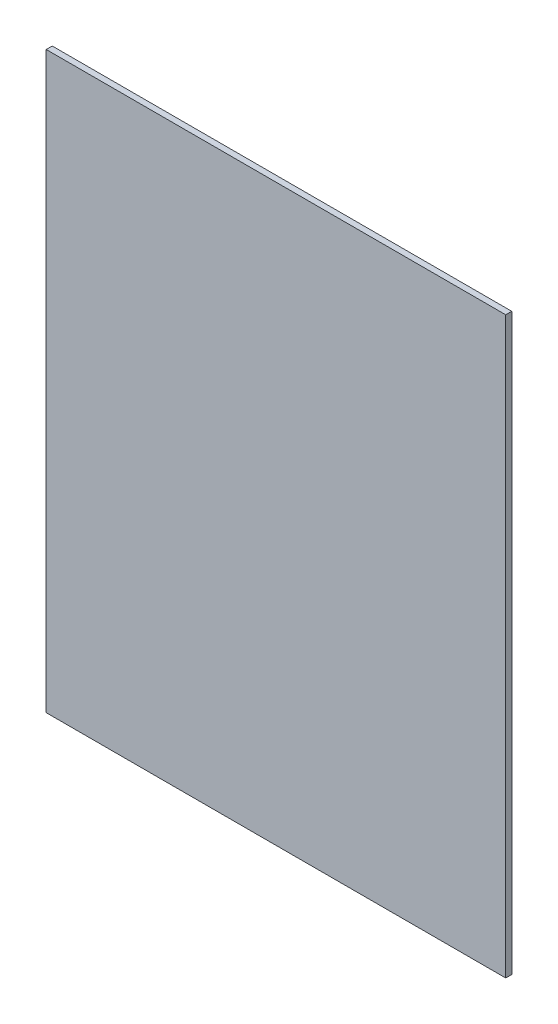
ISO-10303-21;
HEADER;
FILE_DESCRIPTION(('STEP AP214'),'2;1');
FILE_NAME('part.step','',(''),(''),'','','');
FILE_SCHEMA(('AUTOMOTIVE_DESIGN { 1 0 10303 214 1 1 1 1 }'));
ENDSEC;
DATA;
#1=APPLICATION_CONTEXT('core data for automotive mechanical design processes');
#2=APPLICATION_PROTOCOL_DEFINITION('international standard','automotive_design',2000,#1);
#3=PRODUCT_CONTEXT('',#1,'mechanical');
#4=PRODUCT('Part','Part','',(#3));
#5=PRODUCT_RELATED_PRODUCT_CATEGORY('part','',(#4));
#6=PRODUCT_DEFINITION_FORMATION('','',#4);
#7=PRODUCT_DEFINITION_CONTEXT('part definition',#1,'design');
#8=PRODUCT_DEFINITION('design','',#6,#7);
#9=PRODUCT_DEFINITION_SHAPE('','',#8);
#10=(LENGTH_UNIT() NAMED_UNIT(*) SI_UNIT(.MILLI.,.METRE.));
#11=(NAMED_UNIT(*) PLANE_ANGLE_UNIT() SI_UNIT($,.RADIAN.));
#12=(NAMED_UNIT(*) SI_UNIT($,.STERADIAN.) SOLID_ANGLE_UNIT());
#13=UNCERTAINTY_MEASURE_WITH_UNIT(LENGTH_MEASURE(1.E-05),#10,'distance_accuracy_value','');
#14=(GEOMETRIC_REPRESENTATION_CONTEXT(3) GLOBAL_UNCERTAINTY_ASSIGNED_CONTEXT((#13)) GLOBAL_UNIT_ASSIGNED_CONTEXT((#10,
#11,#12)) REPRESENTATION_CONTEXT('',''));
#15=CARTESIAN_POINT('',(0.,0.,0.));
#16=DIRECTION('',(0.,0.,1.));
#17=DIRECTION('',(1.,0.,0.));
#18=AXIS2_PLACEMENT_3D('',#15,#16,#17);
#19=CARTESIAN_POINT('',(76.,-95.,2.));
#20=DIRECTION('',(-1.,0.,0.));
#21=DIRECTION('',(0.,-1.,0.));
#22=AXIS2_PLACEMENT_3D('',#19,#20,#21);
#23=PLANE('',#22);
#24=DIRECTION('',(0.,1.,0.));
#25=VECTOR('',#24,1.);
#26=CARTESIAN_POINT('',(76.,-95.,0.));
#27=LINE('',#26,#25);
#28=CARTESIAN_POINT('',(76.,-95.,0.));
#29=VERTEX_POINT('',#28);
#30=CARTESIAN_POINT('',(76.,95.,0.));
#31=VERTEX_POINT('',#30);
#32=EDGE_CURVE('E96',#29,#31,#27,.T.);
#33=ORIENTED_EDGE('',*,*,#32,.T.);
#34=DIRECTION('',(0.,0.,-1.));
#35=VECTOR('',#34,1.);
#36=CARTESIAN_POINT('',(76.,95.,2.));
#37=LINE('',#36,#35);
#38=CARTESIAN_POINT('',(76.,95.,2.));
#39=VERTEX_POINT('',#38);
#40=EDGE_CURVE('E11',#39,#31,#37,.T.);
#41=ORIENTED_EDGE('',*,*,#40,.F.);
#42=DIRECTION('',(0.,1.,0.));
#43=VECTOR('',#42,1.);
#44=CARTESIAN_POINT('',(76.,-95.,2.));
#45=LINE('',#44,#43);
#46=CARTESIAN_POINT('',(76.,-95.,2.));
#47=VERTEX_POINT('',#46);
#48=EDGE_CURVE('E84',#47,#39,#45,.T.);
#49=ORIENTED_EDGE('',*,*,#48,.F.);
#50=DIRECTION('',(0.,0.,-1.));
#51=VECTOR('',#50,1.);
#52=CARTESIAN_POINT('',(76.,-95.,2.));
#53=LINE('',#52,#51);
#54=EDGE_CURVE('E92',#47,#29,#53,.T.);
#55=ORIENTED_EDGE('',*,*,#54,.T.);
#56=EDGE_LOOP('',(#33,#41,#49,#55));
#57=FACE_BOUND('',#56,.T.);
#58=ADVANCED_FACE('F33',(#57),#23,.F.);
#59=CARTESIAN_POINT('',(-76.,95.,2.));
#60=DIRECTION('',(0.,-1.,0.));
#61=DIRECTION('',(0.,0.,-1.));
#62=AXIS2_PLACEMENT_3D('',#59,#60,#61);
#63=PLANE('',#62);
#64=DIRECTION('',(-1.,0.,0.));
#65=VECTOR('',#64,1.);
#66=CARTESIAN_POINT('',(-76.,95.,0.));
#67=LINE('',#66,#65);
#68=CARTESIAN_POINT('',(-76.,95.,0.));
#69=VERTEX_POINT('',#68);
#70=EDGE_CURVE('E88',#31,#69,#67,.T.);
#71=ORIENTED_EDGE('',*,*,#70,.T.);
#72=DIRECTION('',(0.,0.,-1.));
#73=VECTOR('',#72,1.);
#74=CARTESIAN_POINT('',(-76.,95.,2.));
#75=LINE('',#74,#73);
#76=CARTESIAN_POINT('',(-76.,95.,2.));
#77=VERTEX_POINT('',#76);
#78=EDGE_CURVE('E41',#77,#69,#75,.T.);
#79=ORIENTED_EDGE('',*,*,#78,.F.);
#80=DIRECTION('',(-1.,0.,0.));
#81=VECTOR('',#80,1.);
#82=CARTESIAN_POINT('',(-76.,95.,2.));
#83=LINE('',#82,#81);
#84=EDGE_CURVE('E79',#39,#77,#83,.T.);
#85=ORIENTED_EDGE('',*,*,#84,.F.);
#86=ORIENTED_EDGE('',*,*,#40,.T.);
#87=EDGE_LOOP('',(#71,#79,#85,#86));
#88=FACE_BOUND('',#87,.T.);
#89=ADVANCED_FACE('F87',(#88),#63,.F.);
#90=CARTESIAN_POINT('',(-76.,-95.,2.));
#91=DIRECTION('',(1.,0.,0.));
#92=DIRECTION('',(0.,0.,-1.));
#93=AXIS2_PLACEMENT_3D('',#90,#91,#92);
#94=PLANE('',#93);
#95=DIRECTION('',(0.,-1.,0.));
#96=VECTOR('',#95,1.);
#97=CARTESIAN_POINT('',(-76.,-95.,0.));
#98=LINE('',#97,#96);
#99=CARTESIAN_POINT('',(-76.,-95.,0.));
#100=VERTEX_POINT('',#99);
#101=EDGE_CURVE('E66',#69,#100,#98,.T.);
#102=ORIENTED_EDGE('',*,*,#101,.T.);
#103=DIRECTION('',(0.,0.,-1.));
#104=VECTOR('',#103,1.);
#105=CARTESIAN_POINT('',(-76.,-95.,2.));
#106=LINE('',#105,#104);
#107=CARTESIAN_POINT('',(-76.,-95.,2.));
#108=VERTEX_POINT('',#107);
#109=EDGE_CURVE('E89',#108,#100,#106,.T.);
#110=ORIENTED_EDGE('',*,*,#109,.F.);
#111=DIRECTION('',(0.,-1.,0.));
#112=VECTOR('',#111,1.);
#113=CARTESIAN_POINT('',(-76.,-95.,2.));
#114=LINE('',#113,#112);
#115=EDGE_CURVE('E82',#77,#108,#114,.T.);
#116=ORIENTED_EDGE('',*,*,#115,.F.);
#117=ORIENTED_EDGE('',*,*,#78,.T.);
#118=EDGE_LOOP('',(#102,#110,#116,#117));
#119=FACE_BOUND('',#118,.T.);
#120=ADVANCED_FACE('F90',(#119),#94,.F.);
#121=CARTESIAN_POINT('',(-76.,-95.,2.));
#122=DIRECTION('',(0.,1.,0.));
#123=DIRECTION('',(-1.,0.,0.));
#124=AXIS2_PLACEMENT_3D('',#121,#122,#123);
#125=PLANE('',#124);
#126=DIRECTION('',(1.,0.,0.));
#127=VECTOR('',#126,1.);
#128=CARTESIAN_POINT('',(-76.,-95.,0.));
#129=LINE('',#128,#127);
#130=EDGE_CURVE('E72',#100,#29,#129,.T.);
#131=ORIENTED_EDGE('',*,*,#130,.T.);
#132=ORIENTED_EDGE('',*,*,#54,.F.);
#133=DIRECTION('',(1.,0.,0.));
#134=VECTOR('',#133,1.);
#135=CARTESIAN_POINT('',(-76.,-95.,2.));
#136=LINE('',#135,#134);
#137=EDGE_CURVE('E49',#108,#47,#136,.T.);
#138=ORIENTED_EDGE('',*,*,#137,.F.);
#139=ORIENTED_EDGE('',*,*,#109,.T.);
#140=EDGE_LOOP('',(#131,#132,#138,#139));
#141=FACE_BOUND('',#140,.T.);
#142=ADVANCED_FACE('F103',(#141),#125,.F.);
#143=CARTESIAN_POINT('',(0.,0.,2.));
#144=DIRECTION('',(0.,0.,-1.));
#145=DIRECTION('',(-1.,0.,0.));
#146=AXIS2_PLACEMENT_3D('',#143,#144,#145);
#147=PLANE('',#146);
#148=ORIENTED_EDGE('',*,*,#48,.T.);
#149=ORIENTED_EDGE('',*,*,#84,.T.);
#150=ORIENTED_EDGE('',*,*,#115,.T.);
#151=ORIENTED_EDGE('',*,*,#137,.T.);
#152=EDGE_LOOP('',(#148,#149,#150,#151));
#153=FACE_BOUND('',#152,.T.);
#154=ADVANCED_FACE('F80',(#153),#147,.F.);
#155=CARTESIAN_POINT('',(0.,0.,0.));
#156=DIRECTION('',(0.,0.,-1.));
#157=DIRECTION('',(-1.,0.,0.));
#158=AXIS2_PLACEMENT_3D('',#155,#156,#157);
#159=PLANE('',#158);
#160=ORIENTED_EDGE('',*,*,#32,.F.);
#161=ORIENTED_EDGE('',*,*,#130,.F.);
#162=ORIENTED_EDGE('',*,*,#101,.F.);
#163=ORIENTED_EDGE('',*,*,#70,.F.);
#164=EDGE_LOOP('',(#160,#161,#162,#163));
#165=FACE_BOUND('',#164,.T.);
#166=ADVANCED_FACE('F106',(#165),#159,.T.);
#167=CLOSED_SHELL('',(#58,#89,#120,#142,#154,#166));
#168=MANIFOLD_SOLID_BREP('B2',#167);
#169=ADVANCED_BREP_SHAPE_REPRESENTATION('',(#18,#168),#14);
#170=SHAPE_DEFINITION_REPRESENTATION(#9,#169);
ENDSEC;
END-ISO-10303-21;
